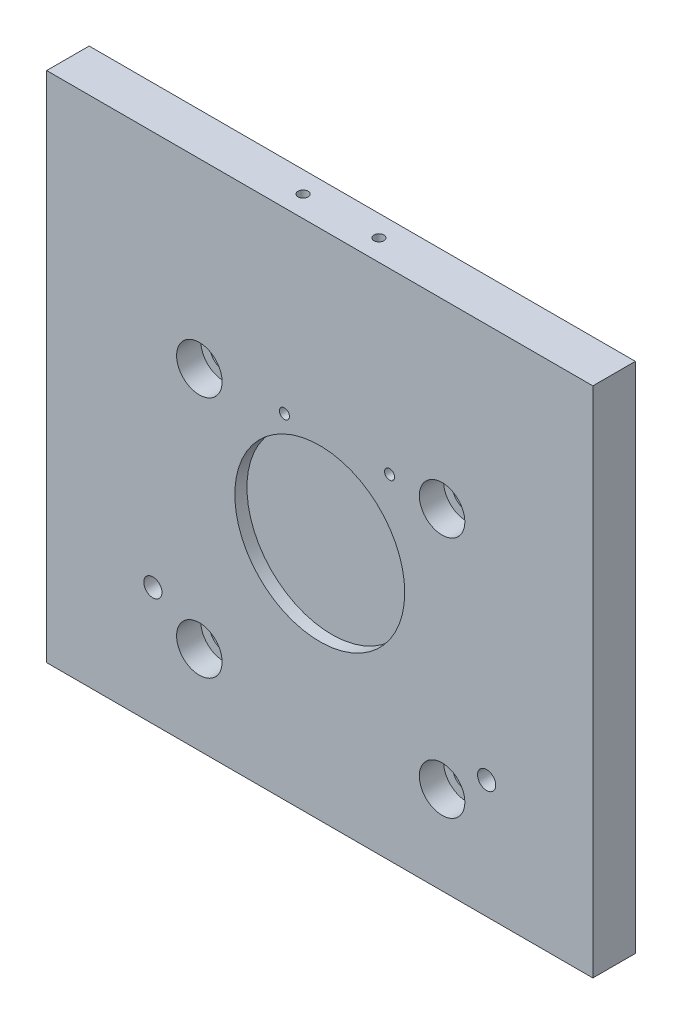
ISO-10303-21;
HEADER;
FILE_DESCRIPTION(('STEP AP214'),'2;1');
FILE_NAME('part.step','',(''),(''),'','','');
FILE_SCHEMA(('AUTOMOTIVE_DESIGN { 1 0 10303 214 1 1 1 1 }'));
ENDSEC;
DATA;
#1=APPLICATION_CONTEXT('core data for automotive mechanical design processes');
#2=APPLICATION_PROTOCOL_DEFINITION('international standard','automotive_design',2000,#1);
#3=PRODUCT_CONTEXT('',#1,'mechanical');
#4=PRODUCT('Part','Part','',(#3));
#5=PRODUCT_RELATED_PRODUCT_CATEGORY('part','',(#4));
#6=PRODUCT_DEFINITION_FORMATION('','',#4);
#7=PRODUCT_DEFINITION_CONTEXT('part definition',#1,'design');
#8=PRODUCT_DEFINITION('design','',#6,#7);
#9=PRODUCT_DEFINITION_SHAPE('','',#8);
#10=(LENGTH_UNIT() NAMED_UNIT(*) SI_UNIT(.MILLI.,.METRE.));
#11=(NAMED_UNIT(*) PLANE_ANGLE_UNIT() SI_UNIT($,.RADIAN.));
#12=(NAMED_UNIT(*) SI_UNIT($,.STERADIAN.) SOLID_ANGLE_UNIT());
#13=UNCERTAINTY_MEASURE_WITH_UNIT(LENGTH_MEASURE(1.E-05),#10,'distance_accuracy_value','');
#14=(GEOMETRIC_REPRESENTATION_CONTEXT(3) GLOBAL_UNCERTAINTY_ASSIGNED_CONTEXT((#13)) GLOBAL_UNIT_ASSIGNED_CONTEXT((#10,
#11,#12)) REPRESENTATION_CONTEXT('',''));
#15=CARTESIAN_POINT('',(0.,0.,0.));
#16=DIRECTION('',(0.,0.,1.));
#17=DIRECTION('',(1.,0.,0.));
#18=AXIS2_PLACEMENT_3D('',#15,#16,#17);
#19=CARTESIAN_POINT('',(-90.,90.,0.));
#20=DIRECTION('',(-1.,0.,0.));
#21=DIRECTION('',(0.,-1.,0.));
#22=AXIS2_PLACEMENT_3D('',#19,#20,#21);
#23=PLANE('',#22);
#24=DIRECTION('',(0.,-1.,0.));
#25=VECTOR('',#24,1.);
#26=CARTESIAN_POINT('',(-90.,90.,14.));
#27=LINE('',#26,#25);
#28=CARTESIAN_POINT('',(-90.,90.,14.));
#29=VERTEX_POINT('',#28);
#30=CARTESIAN_POINT('',(-90.,-79.,14.));
#31=VERTEX_POINT('',#30);
#32=EDGE_CURVE('E106',#29,#31,#27,.T.);
#33=ORIENTED_EDGE('',*,*,#32,.F.);
#34=DIRECTION('',(0.,0.,1.));
#35=VECTOR('',#34,1.);
#36=CARTESIAN_POINT('',(-90.,90.,0.));
#37=LINE('',#36,#35);
#38=CARTESIAN_POINT('',(-90.,90.,0.));
#39=VERTEX_POINT('',#38);
#40=EDGE_CURVE('E11',#39,#29,#37,.T.);
#41=ORIENTED_EDGE('',*,*,#40,.F.);
#42=DIRECTION('',(0.,-1.,0.));
#43=VECTOR('',#42,1.);
#44=CARTESIAN_POINT('',(-90.,90.,0.));
#45=LINE('',#44,#43);
#46=CARTESIAN_POINT('',(-90.,-79.,0.));
#47=VERTEX_POINT('',#46);
#48=EDGE_CURVE('E100',#39,#47,#45,.T.);
#49=ORIENTED_EDGE('',*,*,#48,.T.);
#50=DIRECTION('',(0.,0.,1.));
#51=VECTOR('',#50,1.);
#52=CARTESIAN_POINT('',(-90.,-79.,0.));
#53=LINE('',#52,#51);
#54=EDGE_CURVE('E42',#47,#31,#53,.T.);
#55=ORIENTED_EDGE('',*,*,#54,.T.);
#56=EDGE_LOOP('',(#33,#41,#49,#55));
#57=FACE_BOUND('',#56,.T.);
#58=ADVANCED_FACE('F41',(#57),#23,.T.);
#59=CARTESIAN_POINT('',(90.,90.,0.));
#60=DIRECTION('',(0.,1.,0.));
#61=DIRECTION('',(-1.,0.,0.));
#62=AXIS2_PLACEMENT_3D('',#59,#60,#61);
#63=PLANE('',#62);
#64=CARTESIAN_POINT('',(-12.5,90.,7.));
#65=DIRECTION('',(0.,1.,0.));
#66=DIRECTION('',(0.,0.,1.));
#67=AXIS2_PLACEMENT_3D('',#64,#65,#66);
#68=CIRCLE('',#67,1.64999999999999);
#69=CARTESIAN_POINT('',(-12.5,90.,8.64999999999999));
#70=VERTEX_POINT('',#69);
#71=EDGE_CURVE('E255',#70,#70,#68,.T.);
#72=ORIENTED_EDGE('',*,*,#71,.F.);
#73=EDGE_LOOP('',(#72));
#74=FACE_BOUND('',#73,.T.);
#75=CARTESIAN_POINT('',(12.5,90.,7.));
#76=DIRECTION('',(0.,1.,0.));
#77=DIRECTION('',(0.,0.,1.));
#78=AXIS2_PLACEMENT_3D('',#75,#76,#77);
#79=CIRCLE('',#78,1.64999999999999);
#80=CARTESIAN_POINT('',(12.5,90.,8.64999999999999));
#81=VERTEX_POINT('',#80);
#82=EDGE_CURVE('E251',#81,#81,#79,.T.);
#83=ORIENTED_EDGE('',*,*,#82,.F.);
#84=EDGE_LOOP('',(#83));
#85=FACE_BOUND('',#84,.T.);
#86=DIRECTION('',(-1.,0.,0.));
#87=VECTOR('',#86,1.);
#88=CARTESIAN_POINT('',(90.,90.,14.));
#89=LINE('',#88,#87);
#90=CARTESIAN_POINT('',(90.,90.,14.));
#91=VERTEX_POINT('',#90);
#92=EDGE_CURVE('E103',#91,#29,#89,.T.);
#93=ORIENTED_EDGE('',*,*,#92,.F.);
#94=DIRECTION('',(0.,0.,1.));
#95=VECTOR('',#94,1.);
#96=CARTESIAN_POINT('',(90.,90.,0.));
#97=LINE('',#96,#95);
#98=CARTESIAN_POINT('',(90.,90.,0.));
#99=VERTEX_POINT('',#98);
#100=EDGE_CURVE('E49',#99,#91,#97,.T.);
#101=ORIENTED_EDGE('',*,*,#100,.F.);
#102=DIRECTION('',(-1.,0.,0.));
#103=VECTOR('',#102,1.);
#104=CARTESIAN_POINT('',(90.,90.,0.));
#105=LINE('',#104,#103);
#106=EDGE_CURVE('E98',#99,#39,#105,.T.);
#107=ORIENTED_EDGE('',*,*,#106,.T.);
#108=ORIENTED_EDGE('',*,*,#40,.T.);
#109=EDGE_LOOP('',(#93,#101,#107,#108));
#110=FACE_BOUND('',#109,.T.);
#111=ADVANCED_FACE('F120',(#74,#85,#110),#63,.T.);
#112=CARTESIAN_POINT('',(90.,-79.,0.));
#113=DIRECTION('',(1.,0.,0.));
#114=DIRECTION('',(0.,1.,0.));
#115=AXIS2_PLACEMENT_3D('',#112,#113,#114);
#116=PLANE('',#115);
#117=DIRECTION('',(0.,1.,0.));
#118=VECTOR('',#117,1.);
#119=CARTESIAN_POINT('',(90.,-79.,14.));
#120=LINE('',#119,#118);
#121=CARTESIAN_POINT('',(90.,-79.,14.));
#122=VERTEX_POINT('',#121);
#123=EDGE_CURVE('E93',#122,#91,#120,.T.);
#124=ORIENTED_EDGE('',*,*,#123,.F.);
#125=DIRECTION('',(0.,0.,1.));
#126=VECTOR('',#125,1.);
#127=CARTESIAN_POINT('',(90.,-79.,0.));
#128=LINE('',#127,#126);
#129=CARTESIAN_POINT('',(90.,-79.,0.));
#130=VERTEX_POINT('',#129);
#131=EDGE_CURVE('E86',#130,#122,#128,.T.);
#132=ORIENTED_EDGE('',*,*,#131,.F.);
#133=DIRECTION('',(0.,1.,0.));
#134=VECTOR('',#133,1.);
#135=CARTESIAN_POINT('',(90.,-79.,0.));
#136=LINE('',#135,#134);
#137=EDGE_CURVE('E87',#130,#99,#136,.T.);
#138=ORIENTED_EDGE('',*,*,#137,.T.);
#139=ORIENTED_EDGE('',*,*,#100,.T.);
#140=EDGE_LOOP('',(#124,#132,#138,#139));
#141=FACE_BOUND('',#140,.T.);
#142=ADVANCED_FACE('F88',(#141),#116,.T.);
#143=CARTESIAN_POINT('',(-90.,-79.,0.));
#144=DIRECTION('',(0.,-1.,0.));
#145=DIRECTION('',(0.,0.,-1.));
#146=AXIS2_PLACEMENT_3D('',#143,#144,#145);
#147=PLANE('',#146);
#148=DIRECTION('',(1.,0.,0.));
#149=VECTOR('',#148,1.);
#150=CARTESIAN_POINT('',(-90.,-79.,14.));
#151=LINE('',#150,#149);
#152=EDGE_CURVE('E107',#31,#122,#151,.T.);
#153=ORIENTED_EDGE('',*,*,#152,.F.);
#154=ORIENTED_EDGE('',*,*,#54,.F.);
#155=DIRECTION('',(1.,0.,0.));
#156=VECTOR('',#155,1.);
#157=CARTESIAN_POINT('',(-90.,-79.,0.));
#158=LINE('',#157,#156);
#159=EDGE_CURVE('E92',#47,#130,#158,.T.);
#160=ORIENTED_EDGE('',*,*,#159,.T.);
#161=ORIENTED_EDGE('',*,*,#131,.T.);
#162=EDGE_LOOP('',(#153,#154,#160,#161));
#163=FACE_BOUND('',#162,.T.);
#164=ADVANCED_FACE('F96',(#163),#147,.T.);
#165=CARTESIAN_POINT('',(0.,0.,0.));
#166=DIRECTION('',(0.,0.,1.));
#167=DIRECTION('',(1.,0.,0.));
#168=AXIS2_PLACEMENT_3D('',#165,#166,#167);
#169=PLANE('',#168);
#170=CARTESIAN_POINT('',(40.316,30.077,0.));
#171=DIRECTION('',(0.,0.,1.));
#172=DIRECTION('',(1.,0.,0.));
#173=AXIS2_PLACEMENT_3D('',#170,#171,#172);
#174=CIRCLE('',#173,4.5);
#175=CARTESIAN_POINT('',(44.816,30.077,0.));
#176=VERTEX_POINT('',#175);
#177=EDGE_CURVE('E272',#176,#176,#174,.T.);
#178=ORIENTED_EDGE('',*,*,#177,.T.);
#179=EDGE_LOOP('',(#178));
#180=FACE_BOUND('',#179,.T.);
#181=CARTESIAN_POINT('',(-39.684,30.077,0.));
#182=DIRECTION('',(0.,0.,1.));
#183=DIRECTION('',(1.,0.,0.));
#184=AXIS2_PLACEMENT_3D('',#181,#182,#183);
#185=CIRCLE('',#184,4.5);
#186=CARTESIAN_POINT('',(-35.184,30.077,0.));
#187=VERTEX_POINT('',#186);
#188=EDGE_CURVE('E285',#187,#187,#185,.T.);
#189=ORIENTED_EDGE('',*,*,#188,.T.);
#190=EDGE_LOOP('',(#189));
#191=FACE_BOUND('',#190,.T.);
#192=CARTESIAN_POINT('',(40.316,-49.923,0.));
#193=DIRECTION('',(0.,0.,1.));
#194=DIRECTION('',(1.,0.,0.));
#195=AXIS2_PLACEMENT_3D('',#192,#193,#194);
#196=CIRCLE('',#195,4.5);
#197=CARTESIAN_POINT('',(44.816,-49.923,0.));
#198=VERTEX_POINT('',#197);
#199=EDGE_CURVE('E295',#198,#198,#196,.T.);
#200=ORIENTED_EDGE('',*,*,#199,.T.);
#201=EDGE_LOOP('',(#200));
#202=FACE_BOUND('',#201,.T.);
#203=CARTESIAN_POINT('',(-39.684,-49.923,0.));
#204=DIRECTION('',(0.,0.,1.));
#205=DIRECTION('',(1.,0.,0.));
#206=AXIS2_PLACEMENT_3D('',#203,#204,#205);
#207=CIRCLE('',#206,4.5);
#208=CARTESIAN_POINT('',(-35.184,-49.923,0.));
#209=VERTEX_POINT('',#208);
#210=EDGE_CURVE('E306',#209,#209,#207,.T.);
#211=ORIENTED_EDGE('',*,*,#210,.T.);
#212=EDGE_LOOP('',(#211));
#213=FACE_BOUND('',#212,.T.);
#214=ORIENTED_EDGE('',*,*,#48,.F.);
#215=ORIENTED_EDGE('',*,*,#106,.F.);
#216=ORIENTED_EDGE('',*,*,#137,.F.);
#217=ORIENTED_EDGE('',*,*,#159,.F.);
#218=EDGE_LOOP('',(#214,#215,#216,#217));
#219=FACE_BOUND('',#218,.T.);
#220=ADVANCED_FACE('F94',(#180,#191,#202,#213,#219),#169,.F.);
#221=CARTESIAN_POINT('',(0.,0.,14.));
#222=DIRECTION('',(0.,0.,1.));
#223=DIRECTION('',(1.,0.,0.));
#224=AXIS2_PLACEMENT_3D('',#221,#222,#223);
#225=PLANE('',#224);
#226=CARTESIAN_POINT('',(40.316,30.077,14.));
#227=DIRECTION('',(0.,0.,1.));
#228=DIRECTION('',(1.,0.,0.));
#229=AXIS2_PLACEMENT_3D('',#226,#227,#228);
#230=CIRCLE('',#229,7.5);
#231=CARTESIAN_POINT('',(47.816,30.077,14.));
#232=VERTEX_POINT('',#231);
#233=EDGE_CURVE('E265',#232,#232,#230,.T.);
#234=ORIENTED_EDGE('',*,*,#233,.F.);
#235=EDGE_LOOP('',(#234));
#236=FACE_BOUND('',#235,.T.);
#237=CARTESIAN_POINT('',(-39.684,30.077,14.));
#238=DIRECTION('',(0.,0.,1.));
#239=DIRECTION('',(1.,0.,0.));
#240=AXIS2_PLACEMENT_3D('',#237,#238,#239);
#241=CIRCLE('',#240,7.49999999999999);
#242=CARTESIAN_POINT('',(-32.184,30.077,14.));
#243=VERTEX_POINT('',#242);
#244=EDGE_CURVE('E271',#243,#243,#241,.T.);
#245=ORIENTED_EDGE('',*,*,#244,.F.);
#246=EDGE_LOOP('',(#245));
#247=FACE_BOUND('',#246,.T.);
#248=CARTESIAN_POINT('',(40.316,-49.923,14.));
#249=DIRECTION('',(0.,0.,1.));
#250=DIRECTION('',(1.,0.,0.));
#251=AXIS2_PLACEMENT_3D('',#248,#249,#250);
#252=CIRCLE('',#251,7.5);
#253=CARTESIAN_POINT('',(47.816,-49.923,14.));
#254=VERTEX_POINT('',#253);
#255=EDGE_CURVE('E284',#254,#254,#252,.T.);
#256=ORIENTED_EDGE('',*,*,#255,.F.);
#257=EDGE_LOOP('',(#256));
#258=FACE_BOUND('',#257,.T.);
#259=CARTESIAN_POINT('',(-39.684,-49.923,14.));
#260=DIRECTION('',(0.,0.,1.));
#261=DIRECTION('',(1.,0.,0.));
#262=AXIS2_PLACEMENT_3D('',#259,#260,#261);
#263=CIRCLE('',#262,7.49999999999999);
#264=CARTESIAN_POINT('',(-32.184,-49.923,14.));
#265=VERTEX_POINT('',#264);
#266=EDGE_CURVE('E300',#265,#265,#263,.T.);
#267=ORIENTED_EDGE('',*,*,#266,.F.);
#268=EDGE_LOOP('',(#267));
#269=FACE_BOUND('',#268,.T.);
#270=CARTESIAN_POINT('',(23.,31.25,14.));
#271=DIRECTION('',(0.,0.,1.));
#272=DIRECTION('',(1.,0.,0.));
#273=AXIS2_PLACEMENT_3D('',#270,#271,#272);
#274=CIRCLE('',#273,1.64999999999999);
#275=CARTESIAN_POINT('',(24.65,31.25,14.));
#276=VERTEX_POINT('',#275);
#277=EDGE_CURVE('E307',#276,#276,#274,.T.);
#278=ORIENTED_EDGE('',*,*,#277,.F.);
#279=EDGE_LOOP('',(#278));
#280=FACE_BOUND('',#279,.T.);
#281=CARTESIAN_POINT('',(-11.64,31.25,14.));
#282=DIRECTION('',(0.,0.,1.));
#283=DIRECTION('',(1.,0.,0.));
#284=AXIS2_PLACEMENT_3D('',#281,#282,#283);
#285=CIRCLE('',#284,1.64999999999999);
#286=CARTESIAN_POINT('',(-9.99000000000001,31.25,14.));
#287=VERTEX_POINT('',#286);
#288=EDGE_CURVE('E314',#287,#287,#285,.T.);
#289=ORIENTED_EDGE('',*,*,#288,.F.);
#290=EDGE_LOOP('',(#289));
#291=FACE_BOUND('',#290,.T.);
#292=CARTESIAN_POINT('',(0.,0.,14.));
#293=DIRECTION('',(0.,0.,1.));
#294=DIRECTION('',(1.,0.,0.));
#295=AXIS2_PLACEMENT_3D('',#292,#293,#294);
#296=CIRCLE('',#295,28.);
#297=CARTESIAN_POINT('',(28.,0.,14.));
#298=VERTEX_POINT('',#297);
#299=EDGE_CURVE('E322',#298,#298,#296,.T.);
#300=ORIENTED_EDGE('',*,*,#299,.F.);
#301=EDGE_LOOP('',(#300));
#302=FACE_BOUND('',#301,.T.);
#303=CARTESIAN_POINT('',(55.,-40.,14.));
#304=DIRECTION('',(0.,0.,1.));
#305=DIRECTION('',(1.,0.,0.));
#306=AXIS2_PLACEMENT_3D('',#303,#304,#305);
#307=CIRCLE('',#306,3.);
#308=CARTESIAN_POINT('',(58.,-40.,14.));
#309=VERTEX_POINT('',#308);
#310=EDGE_CURVE('E330',#309,#309,#307,.T.);
#311=ORIENTED_EDGE('',*,*,#310,.F.);
#312=EDGE_LOOP('',(#311));
#313=FACE_BOUND('',#312,.T.);
#314=CARTESIAN_POINT('',(-55.,-40.,14.));
#315=DIRECTION('',(0.,0.,1.));
#316=DIRECTION('',(1.,0.,0.));
#317=AXIS2_PLACEMENT_3D('',#314,#315,#316);
#318=CIRCLE('',#317,3.);
#319=CARTESIAN_POINT('',(-52.,-40.,14.));
#320=VERTEX_POINT('',#319);
#321=EDGE_CURVE('E331',#320,#320,#318,.T.);
#322=ORIENTED_EDGE('',*,*,#321,.F.);
#323=EDGE_LOOP('',(#322));
#324=FACE_BOUND('',#323,.T.);
#325=ORIENTED_EDGE('',*,*,#32,.T.);
#326=ORIENTED_EDGE('',*,*,#152,.T.);
#327=ORIENTED_EDGE('',*,*,#123,.T.);
#328=ORIENTED_EDGE('',*,*,#92,.T.);
#329=EDGE_LOOP('',(#325,#326,#327,#328));
#330=FACE_BOUND('',#329,.T.);
#331=ADVANCED_FACE('F116',(#236,#247,#258,#269,#280,#291,#302,#313,#324,#330),#225,.T.);
#332=CARTESIAN_POINT('',(-55.,-40.,4.00000000000001));
#333=DIRECTION('',(0.,0.,-1.));
#334=DIRECTION('',(-1.,0.,0.));
#335=AXIS2_PLACEMENT_3D('',#332,#333,#334);
#336=PLANE('',#335);
#337=CARTESIAN_POINT('',(-55.,-40.,4.00000000000001));
#338=DIRECTION('',(0.,0.,1.));
#339=DIRECTION('',(1.,0.,0.));
#340=AXIS2_PLACEMENT_3D('',#337,#338,#339);
#341=CIRCLE('',#340,2.99999999999999);
#342=CARTESIAN_POINT('',(-52.,-40.,4.00000000000001));
#343=VERTEX_POINT('',#342);
#344=EDGE_CURVE('E109',#343,#343,#341,.T.);
#345=ORIENTED_EDGE('',*,*,#344,.T.);
#346=EDGE_LOOP('',(#345));
#347=FACE_BOUND('',#346,.T.);
#348=ADVANCED_FACE('F145',(#347),#336,.F.);
#349=CARTESIAN_POINT('',(-55.,-40.,14.));
#350=DIRECTION('',(0.,0.,1.));
#351=DIRECTION('',(1.,0.,0.));
#352=AXIS2_PLACEMENT_3D('',#349,#350,#351);
#353=CYLINDRICAL_SURFACE('',#352,2.99999999999999);
#354=ORIENTED_EDGE('',*,*,#344,.F.);
#355=EDGE_LOOP('',(#354));
#356=FACE_BOUND('',#355,.T.);
#357=ORIENTED_EDGE('',*,*,#321,.T.);
#358=EDGE_LOOP('',(#357));
#359=FACE_BOUND('',#358,.T.);
#360=ADVANCED_FACE('F150',(#356,#359),#353,.F.);
#361=CARTESIAN_POINT('',(55.,-40.,4.00000000000001));
#362=DIRECTION('',(0.,0.,-1.));
#363=DIRECTION('',(-1.,0.,0.));
#364=AXIS2_PLACEMENT_3D('',#361,#362,#363);
#365=PLANE('',#364);
#366=CARTESIAN_POINT('',(55.,-40.,4.00000000000001));
#367=DIRECTION('',(0.,0.,1.));
#368=DIRECTION('',(1.,0.,0.));
#369=AXIS2_PLACEMENT_3D('',#366,#367,#368);
#370=CIRCLE('',#369,2.99999999999999);
#371=CARTESIAN_POINT('',(58.,-40.,4.00000000000001));
#372=VERTEX_POINT('',#371);
#373=EDGE_CURVE('E329',#372,#372,#370,.T.);
#374=ORIENTED_EDGE('',*,*,#373,.T.);
#375=EDGE_LOOP('',(#374));
#376=FACE_BOUND('',#375,.T.);
#377=ADVANCED_FACE('F155',(#376),#365,.F.);
#378=CARTESIAN_POINT('',(55.,-40.,14.));
#379=DIRECTION('',(0.,0.,1.));
#380=DIRECTION('',(1.,0.,0.));
#381=AXIS2_PLACEMENT_3D('',#378,#379,#380);
#382=CYLINDRICAL_SURFACE('',#381,2.99999999999999);
#383=ORIENTED_EDGE('',*,*,#373,.F.);
#384=EDGE_LOOP('',(#383));
#385=FACE_BOUND('',#384,.T.);
#386=ORIENTED_EDGE('',*,*,#310,.T.);
#387=EDGE_LOOP('',(#386));
#388=FACE_BOUND('',#387,.T.);
#389=ADVANCED_FACE('F158',(#385,#388),#382,.F.);
#390=CARTESIAN_POINT('',(0.,0.,10.));
#391=DIRECTION('',(0.,0.,-1.));
#392=DIRECTION('',(-1.,0.,0.));
#393=AXIS2_PLACEMENT_3D('',#390,#391,#392);
#394=PLANE('',#393);
#395=CARTESIAN_POINT('',(0.,0.,10.));
#396=DIRECTION('',(0.,0.,1.));
#397=DIRECTION('',(1.,0.,0.));
#398=AXIS2_PLACEMENT_3D('',#395,#396,#397);
#399=CIRCLE('',#398,28.);
#400=CARTESIAN_POINT('',(28.,0.,10.));
#401=VERTEX_POINT('',#400);
#402=EDGE_CURVE('E321',#401,#401,#399,.T.);
#403=ORIENTED_EDGE('',*,*,#402,.T.);
#404=EDGE_LOOP('',(#403));
#405=FACE_BOUND('',#404,.T.);
#406=ADVANCED_FACE('F157',(#405),#394,.F.);
#407=CARTESIAN_POINT('',(0.,0.,14.));
#408=DIRECTION('',(0.,0.,1.));
#409=DIRECTION('',(1.,0.,0.));
#410=AXIS2_PLACEMENT_3D('',#407,#408,#409);
#411=CYLINDRICAL_SURFACE('',#410,28.);
#412=ORIENTED_EDGE('',*,*,#402,.F.);
#413=EDGE_LOOP('',(#412));
#414=FACE_BOUND('',#413,.T.);
#415=ORIENTED_EDGE('',*,*,#299,.T.);
#416=EDGE_LOOP('',(#415));
#417=FACE_BOUND('',#416,.T.);
#418=ADVANCED_FACE('F165',(#414,#417),#411,.F.);
#419=CARTESIAN_POINT('',(-11.64,31.25,6.00000000000001));
#420=DIRECTION('',(0.,0.,-1.));
#421=DIRECTION('',(-1.,0.,0.));
#422=AXIS2_PLACEMENT_3D('',#419,#420,#421);
#423=PLANE('',#422);
#424=CARTESIAN_POINT('',(-11.64,31.25,6.00000000000001));
#425=DIRECTION('',(0.,0.,1.));
#426=DIRECTION('',(1.,0.,0.));
#427=AXIS2_PLACEMENT_3D('',#424,#425,#426);
#428=CIRCLE('',#427,1.64999999999999);
#429=CARTESIAN_POINT('',(-9.99000000000001,31.25,6.00000000000001));
#430=VERTEX_POINT('',#429);
#431=EDGE_CURVE('E319',#430,#430,#428,.T.);
#432=ORIENTED_EDGE('',*,*,#431,.T.);
#433=EDGE_LOOP('',(#432));
#434=FACE_BOUND('',#433,.T.);
#435=ADVANCED_FACE('F166',(#434),#423,.F.);
#436=CARTESIAN_POINT('',(-11.64,31.25,14.));
#437=DIRECTION('',(0.,0.,1.));
#438=DIRECTION('',(1.,0.,0.));
#439=AXIS2_PLACEMENT_3D('',#436,#437,#438);
#440=CYLINDRICAL_SURFACE('',#439,1.64999999999999);
#441=ORIENTED_EDGE('',*,*,#431,.F.);
#442=EDGE_LOOP('',(#441));
#443=FACE_BOUND('',#442,.T.);
#444=ORIENTED_EDGE('',*,*,#288,.T.);
#445=EDGE_LOOP('',(#444));
#446=FACE_BOUND('',#445,.T.);
#447=ADVANCED_FACE('F175',(#443,#446),#440,.F.);
#448=CARTESIAN_POINT('',(23.,31.25,6.00000000000001));
#449=DIRECTION('',(0.,0.,-1.));
#450=DIRECTION('',(-1.,0.,0.));
#451=AXIS2_PLACEMENT_3D('',#448,#449,#450);
#452=PLANE('',#451);
#453=CARTESIAN_POINT('',(23.,31.25,6.00000000000001));
#454=DIRECTION('',(0.,0.,1.));
#455=DIRECTION('',(1.,0.,0.));
#456=AXIS2_PLACEMENT_3D('',#453,#454,#455);
#457=CIRCLE('',#456,1.64999999999998);
#458=CARTESIAN_POINT('',(24.65,31.25,6.00000000000001));
#459=VERTEX_POINT('',#458);
#460=EDGE_CURVE('E315',#459,#459,#457,.T.);
#461=ORIENTED_EDGE('',*,*,#460,.T.);
#462=EDGE_LOOP('',(#461));
#463=FACE_BOUND('',#462,.T.);
#464=ADVANCED_FACE('F176',(#463),#452,.F.);
#465=CARTESIAN_POINT('',(23.,31.25,14.));
#466=DIRECTION('',(0.,0.,1.));
#467=DIRECTION('',(1.,0.,0.));
#468=AXIS2_PLACEMENT_3D('',#465,#466,#467);
#469=CYLINDRICAL_SURFACE('',#468,1.64999999999999);
#470=ORIENTED_EDGE('',*,*,#460,.F.);
#471=EDGE_LOOP('',(#470));
#472=FACE_BOUND('',#471,.T.);
#473=ORIENTED_EDGE('',*,*,#277,.T.);
#474=EDGE_LOOP('',(#473));
#475=FACE_BOUND('',#474,.T.);
#476=ADVANCED_FACE('F179',(#472,#475),#469,.F.);
#477=CARTESIAN_POINT('',(-39.684,-49.923,14.));
#478=DIRECTION('',(0.,0.,1.));
#479=DIRECTION('',(1.,0.,0.));
#480=AXIS2_PLACEMENT_3D('',#477,#478,#479);
#481=CYLINDRICAL_SURFACE('',#480,4.5);
#482=ORIENTED_EDGE('',*,*,#210,.F.);
#483=EDGE_LOOP('',(#482));
#484=FACE_BOUND('',#483,.T.);
#485=CARTESIAN_POINT('',(-39.684,-49.923,6.));
#486=DIRECTION('',(0.,0.,1.));
#487=DIRECTION('',(1.,0.,0.));
#488=AXIS2_PLACEMENT_3D('',#485,#486,#487);
#489=CIRCLE('',#488,4.5);
#490=CARTESIAN_POINT('',(-35.184,-49.923,6.));
#491=VERTEX_POINT('',#490);
#492=EDGE_CURVE('E303',#491,#491,#489,.T.);
#493=ORIENTED_EDGE('',*,*,#492,.T.);
#494=EDGE_LOOP('',(#493));
#495=FACE_BOUND('',#494,.T.);
#496=ADVANCED_FACE('F182',(#484,#495),#481,.F.);
#497=CARTESIAN_POINT('',(-35.184,-49.923,6.));
#498=DIRECTION('',(0.,0.,-1.));
#499=DIRECTION('',(-1.,0.,0.));
#500=AXIS2_PLACEMENT_3D('',#497,#498,#499);
#501=PLANE('',#500);
#502=ORIENTED_EDGE('',*,*,#492,.F.);
#503=EDGE_LOOP('',(#502));
#504=FACE_BOUND('',#503,.T.);
#505=CARTESIAN_POINT('',(-39.684,-49.923,6.));
#506=DIRECTION('',(0.,0.,1.));
#507=DIRECTION('',(1.,0.,0.));
#508=AXIS2_PLACEMENT_3D('',#505,#506,#507);
#509=CIRCLE('',#508,7.49999999999999);
#510=CARTESIAN_POINT('',(-32.184,-49.923,6.));
#511=VERTEX_POINT('',#510);
#512=EDGE_CURVE('E297',#511,#511,#509,.T.);
#513=ORIENTED_EDGE('',*,*,#512,.T.);
#514=EDGE_LOOP('',(#513));
#515=FACE_BOUND('',#514,.T.);
#516=ADVANCED_FACE('F190',(#504,#515),#501,.F.);
#517=CARTESIAN_POINT('',(-39.684,-49.923,14.));
#518=DIRECTION('',(0.,0.,1.));
#519=DIRECTION('',(1.,0.,0.));
#520=AXIS2_PLACEMENT_3D('',#517,#518,#519);
#521=CYLINDRICAL_SURFACE('',#520,7.49999999999999);
#522=ORIENTED_EDGE('',*,*,#512,.F.);
#523=EDGE_LOOP('',(#522));
#524=FACE_BOUND('',#523,.T.);
#525=ORIENTED_EDGE('',*,*,#266,.T.);
#526=EDGE_LOOP('',(#525));
#527=FACE_BOUND('',#526,.T.);
#528=ADVANCED_FACE('F192',(#524,#527),#521,.F.);
#529=CARTESIAN_POINT('',(40.316,-49.923,14.));
#530=DIRECTION('',(0.,0.,1.));
#531=DIRECTION('',(1.,0.,0.));
#532=AXIS2_PLACEMENT_3D('',#529,#530,#531);
#533=CYLINDRICAL_SURFACE('',#532,4.50000000000001);
#534=ORIENTED_EDGE('',*,*,#199,.F.);
#535=EDGE_LOOP('',(#534));
#536=FACE_BOUND('',#535,.T.);
#537=CARTESIAN_POINT('',(40.316,-49.923,6.));
#538=DIRECTION('',(0.,0.,1.));
#539=DIRECTION('',(1.,0.,0.));
#540=AXIS2_PLACEMENT_3D('',#537,#538,#539);
#541=CIRCLE('',#540,4.50000000000001);
#542=CARTESIAN_POINT('',(44.816,-49.923,6.));
#543=VERTEX_POINT('',#542);
#544=EDGE_CURVE('E293',#543,#543,#541,.T.);
#545=ORIENTED_EDGE('',*,*,#544,.T.);
#546=EDGE_LOOP('',(#545));
#547=FACE_BOUND('',#546,.T.);
#548=ADVANCED_FACE('F193',(#536,#547),#533,.F.);
#549=CARTESIAN_POINT('',(44.816,-49.923,6.));
#550=DIRECTION('',(0.,0.,-1.));
#551=DIRECTION('',(-1.,0.,0.));
#552=AXIS2_PLACEMENT_3D('',#549,#550,#551);
#553=PLANE('',#552);
#554=ORIENTED_EDGE('',*,*,#544,.F.);
#555=EDGE_LOOP('',(#554));
#556=FACE_BOUND('',#555,.T.);
#557=CARTESIAN_POINT('',(40.316,-49.923,6.));
#558=DIRECTION('',(0.,0.,1.));
#559=DIRECTION('',(1.,0.,0.));
#560=AXIS2_PLACEMENT_3D('',#557,#558,#559);
#561=CIRCLE('',#560,7.5);
#562=CARTESIAN_POINT('',(47.816,-49.923,6.));
#563=VERTEX_POINT('',#562);
#564=EDGE_CURVE('E286',#563,#563,#561,.T.);
#565=ORIENTED_EDGE('',*,*,#564,.T.);
#566=EDGE_LOOP('',(#565));
#567=FACE_BOUND('',#566,.T.);
#568=ADVANCED_FACE('F197',(#556,#567),#553,.F.);
#569=CARTESIAN_POINT('',(40.316,-49.923,14.));
#570=DIRECTION('',(0.,0.,1.));
#571=DIRECTION('',(1.,0.,0.));
#572=AXIS2_PLACEMENT_3D('',#569,#570,#571);
#573=CYLINDRICAL_SURFACE('',#572,7.5);
#574=ORIENTED_EDGE('',*,*,#564,.F.);
#575=EDGE_LOOP('',(#574));
#576=FACE_BOUND('',#575,.T.);
#577=ORIENTED_EDGE('',*,*,#255,.T.);
#578=EDGE_LOOP('',(#577));
#579=FACE_BOUND('',#578,.T.);
#580=ADVANCED_FACE('F201',(#576,#579),#573,.F.);
#581=CARTESIAN_POINT('',(-39.684,30.077,14.));
#582=DIRECTION('',(0.,0.,1.));
#583=DIRECTION('',(1.,0.,0.));
#584=AXIS2_PLACEMENT_3D('',#581,#582,#583);
#585=CYLINDRICAL_SURFACE('',#584,4.5);
#586=ORIENTED_EDGE('',*,*,#188,.F.);
#587=EDGE_LOOP('',(#586));
#588=FACE_BOUND('',#587,.T.);
#589=CARTESIAN_POINT('',(-39.684,30.077,6.));
#590=DIRECTION('',(0.,0.,1.));
#591=DIRECTION('',(1.,0.,0.));
#592=AXIS2_PLACEMENT_3D('',#589,#590,#591);
#593=CIRCLE('',#592,4.5);
#594=CARTESIAN_POINT('',(-35.184,30.077,6.));
#595=VERTEX_POINT('',#594);
#596=EDGE_CURVE('E276',#595,#595,#593,.T.);
#597=ORIENTED_EDGE('',*,*,#596,.T.);
#598=EDGE_LOOP('',(#597));
#599=FACE_BOUND('',#598,.T.);
#600=ADVANCED_FACE('F210',(#588,#599),#585,.F.);
#601=CARTESIAN_POINT('',(-35.184,30.077,6.));
#602=DIRECTION('',(0.,0.,-1.));
#603=DIRECTION('',(-1.,0.,0.));
#604=AXIS2_PLACEMENT_3D('',#601,#602,#603);
#605=PLANE('',#604);
#606=ORIENTED_EDGE('',*,*,#596,.F.);
#607=EDGE_LOOP('',(#606));
#608=FACE_BOUND('',#607,.T.);
#609=CARTESIAN_POINT('',(-39.684,30.077,6.));
#610=DIRECTION('',(0.,0.,1.));
#611=DIRECTION('',(1.,0.,0.));
#612=AXIS2_PLACEMENT_3D('',#609,#610,#611);
#613=CIRCLE('',#612,7.49999999999999);
#614=CARTESIAN_POINT('',(-32.184,30.077,6.));
#615=VERTEX_POINT('',#614);
#616=EDGE_CURVE('E277',#615,#615,#613,.T.);
#617=ORIENTED_EDGE('',*,*,#616,.T.);
#618=EDGE_LOOP('',(#617));
#619=FACE_BOUND('',#618,.T.);
#620=ADVANCED_FACE('F212',(#608,#619),#605,.F.);
#621=CARTESIAN_POINT('',(-39.684,30.077,14.));
#622=DIRECTION('',(0.,0.,1.));
#623=DIRECTION('',(1.,0.,0.));
#624=AXIS2_PLACEMENT_3D('',#621,#622,#623);
#625=CYLINDRICAL_SURFACE('',#624,7.49999999999999);
#626=ORIENTED_EDGE('',*,*,#616,.F.);
#627=EDGE_LOOP('',(#626));
#628=FACE_BOUND('',#627,.T.);
#629=ORIENTED_EDGE('',*,*,#244,.T.);
#630=EDGE_LOOP('',(#629));
#631=FACE_BOUND('',#630,.T.);
#632=ADVANCED_FACE('F213',(#628,#631),#625,.F.);
#633=CARTESIAN_POINT('',(40.316,30.077,14.));
#634=DIRECTION('',(0.,0.,1.));
#635=DIRECTION('',(1.,0.,0.));
#636=AXIS2_PLACEMENT_3D('',#633,#634,#635);
#637=CYLINDRICAL_SURFACE('',#636,4.50000000000001);
#638=ORIENTED_EDGE('',*,*,#177,.F.);
#639=EDGE_LOOP('',(#638));
#640=FACE_BOUND('',#639,.T.);
#641=CARTESIAN_POINT('',(40.316,30.077,6.));
#642=DIRECTION('',(0.,0.,1.));
#643=DIRECTION('',(1.,0.,0.));
#644=AXIS2_PLACEMENT_3D('',#641,#642,#643);
#645=CIRCLE('',#644,4.50000000000001);
#646=CARTESIAN_POINT('',(44.816,30.077,6.));
#647=VERTEX_POINT('',#646);
#648=EDGE_CURVE('E266',#647,#647,#645,.T.);
#649=ORIENTED_EDGE('',*,*,#648,.T.);
#650=EDGE_LOOP('',(#649));
#651=FACE_BOUND('',#650,.T.);
#652=ADVANCED_FACE('F217',(#640,#651),#637,.F.);
#653=CARTESIAN_POINT('',(44.816,30.077,6.));
#654=DIRECTION('',(0.,0.,-1.));
#655=DIRECTION('',(-1.,0.,0.));
#656=AXIS2_PLACEMENT_3D('',#653,#654,#655);
#657=PLANE('',#656);
#658=ORIENTED_EDGE('',*,*,#648,.F.);
#659=EDGE_LOOP('',(#658));
#660=FACE_BOUND('',#659,.T.);
#661=CARTESIAN_POINT('',(40.316,30.077,6.));
#662=DIRECTION('',(0.,0.,1.));
#663=DIRECTION('',(1.,0.,0.));
#664=AXIS2_PLACEMENT_3D('',#661,#662,#663);
#665=CIRCLE('',#664,7.5);
#666=CARTESIAN_POINT('',(47.816,30.077,6.));
#667=VERTEX_POINT('',#666);
#668=EDGE_CURVE('E264',#667,#667,#665,.T.);
#669=ORIENTED_EDGE('',*,*,#668,.T.);
#670=EDGE_LOOP('',(#669));
#671=FACE_BOUND('',#670,.T.);
#672=ADVANCED_FACE('F221',(#660,#671),#657,.F.);
#673=CARTESIAN_POINT('',(40.316,30.077,14.));
#674=DIRECTION('',(0.,0.,1.));
#675=DIRECTION('',(1.,0.,0.));
#676=AXIS2_PLACEMENT_3D('',#673,#674,#675);
#677=CYLINDRICAL_SURFACE('',#676,7.5);
#678=ORIENTED_EDGE('',*,*,#668,.F.);
#679=EDGE_LOOP('',(#678));
#680=FACE_BOUND('',#679,.T.);
#681=ORIENTED_EDGE('',*,*,#233,.T.);
#682=EDGE_LOOP('',(#681));
#683=FACE_BOUND('',#682,.T.);
#684=ADVANCED_FACE('F227',(#680,#683),#677,.F.);
#685=CARTESIAN_POINT('',(12.5,80.,7.));
#686=DIRECTION('',(0.,-1.,0.));
#687=DIRECTION('',(0.,0.,-1.));
#688=AXIS2_PLACEMENT_3D('',#685,#686,#687);
#689=PLANE('',#688);
#690=CARTESIAN_POINT('',(12.5,80.,7.));
#691=DIRECTION('',(0.,1.,0.));
#692=DIRECTION('',(0.,0.,1.));
#693=AXIS2_PLACEMENT_3D('',#690,#691,#692);
#694=CIRCLE('',#693,1.64999999999999);
#695=CARTESIAN_POINT('',(12.5,80.,8.64999999999999));
#696=VERTEX_POINT('',#695);
#697=EDGE_CURVE('E256',#696,#696,#694,.T.);
#698=ORIENTED_EDGE('',*,*,#697,.T.);
#699=EDGE_LOOP('',(#698));
#700=FACE_BOUND('',#699,.T.);
#701=ADVANCED_FACE('F229',(#700),#689,.F.);
#702=CARTESIAN_POINT('',(12.5,90.,7.));
#703=DIRECTION('',(0.,1.,0.));
#704=DIRECTION('',(0.,0.,1.));
#705=AXIS2_PLACEMENT_3D('',#702,#703,#704);
#706=CYLINDRICAL_SURFACE('',#705,1.64999999999999);
#707=ORIENTED_EDGE('',*,*,#697,.F.);
#708=EDGE_LOOP('',(#707));
#709=FACE_BOUND('',#708,.T.);
#710=ORIENTED_EDGE('',*,*,#82,.T.);
#711=EDGE_LOOP('',(#710));
#712=FACE_BOUND('',#711,.T.);
#713=ADVANCED_FACE('F231',(#709,#712),#706,.F.);
#714=CARTESIAN_POINT('',(-12.5,80.,7.));
#715=DIRECTION('',(0.,-1.,0.));
#716=DIRECTION('',(0.,0.,-1.));
#717=AXIS2_PLACEMENT_3D('',#714,#715,#716);
#718=PLANE('',#717);
#719=CARTESIAN_POINT('',(-12.5,80.,7.));
#720=DIRECTION('',(0.,1.,0.));
#721=DIRECTION('',(0.,0.,1.));
#722=AXIS2_PLACEMENT_3D('',#719,#720,#721);
#723=CIRCLE('',#722,1.64999999999999);
#724=CARTESIAN_POINT('',(-12.5,80.,8.64999999999999));
#725=VERTEX_POINT('',#724);
#726=EDGE_CURVE('E249',#725,#725,#723,.T.);
#727=ORIENTED_EDGE('',*,*,#726,.T.);
#728=EDGE_LOOP('',(#727));
#729=FACE_BOUND('',#728,.T.);
#730=ADVANCED_FACE('F240',(#729),#718,.F.);
#731=CARTESIAN_POINT('',(-12.5,90.,7.));
#732=DIRECTION('',(0.,1.,0.));
#733=DIRECTION('',(0.,0.,1.));
#734=AXIS2_PLACEMENT_3D('',#731,#732,#733);
#735=CYLINDRICAL_SURFACE('',#734,1.64999999999999);
#736=ORIENTED_EDGE('',*,*,#726,.F.);
#737=EDGE_LOOP('',(#736));
#738=FACE_BOUND('',#737,.T.);
#739=ORIENTED_EDGE('',*,*,#71,.T.);
#740=EDGE_LOOP('',(#739));
#741=FACE_BOUND('',#740,.T.);
#742=ADVANCED_FACE('F241',(#738,#741),#735,.F.);
#743=CLOSED_SHELL('',(#58,#111,#142,#164,#220,#331,#348,#360,#377,#389,#406,#418,#435,#447,#464,
#476,#496,#516,#528,#548,#568,#580,#600,#620,#632,#652,#672,#684,#701,#713,#730,#742));
#744=MANIFOLD_SOLID_BREP('B2',#743);
#745=ADVANCED_BREP_SHAPE_REPRESENTATION('',(#18,#744),#14);
#746=SHAPE_DEFINITION_REPRESENTATION(#9,#745);
ENDSEC;
END-ISO-10303-21;
